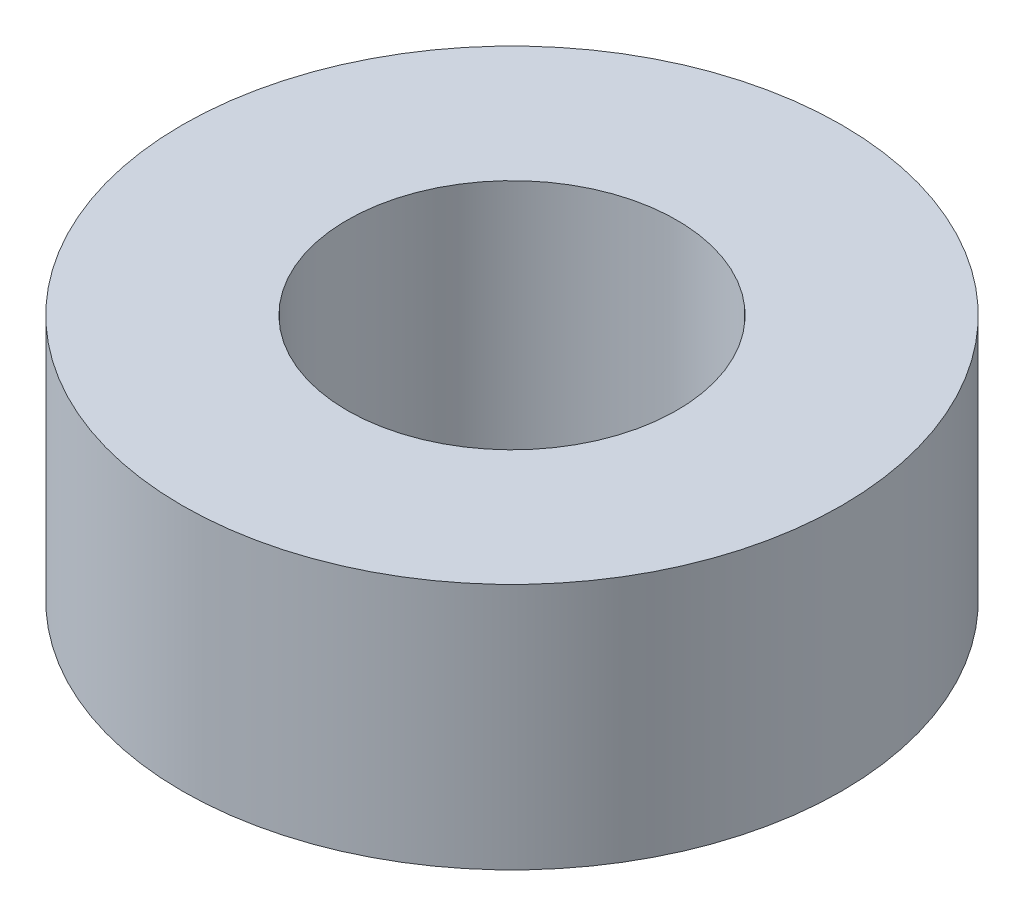
ISO-10303-21;
HEADER;
FILE_DESCRIPTION(('STEP AP214'),'2;1');
FILE_NAME('part.step','',(''),(''),'','','');
FILE_SCHEMA(('AUTOMOTIVE_DESIGN { 1 0 10303 214 1 1 1 1 }'));
ENDSEC;
DATA;
#1=APPLICATION_CONTEXT('core data for automotive mechanical design processes');
#2=APPLICATION_PROTOCOL_DEFINITION('international standard','automotive_design',2000,#1);
#3=PRODUCT_CONTEXT('',#1,'mechanical');
#4=PRODUCT('Part','Part','',(#3));
#5=PRODUCT_RELATED_PRODUCT_CATEGORY('part','',(#4));
#6=PRODUCT_DEFINITION_FORMATION('','',#4);
#7=PRODUCT_DEFINITION_CONTEXT('part definition',#1,'design');
#8=PRODUCT_DEFINITION('design','',#6,#7);
#9=PRODUCT_DEFINITION_SHAPE('','',#8);
#10=(LENGTH_UNIT() NAMED_UNIT(*) SI_UNIT(.MILLI.,.METRE.));
#11=(NAMED_UNIT(*) PLANE_ANGLE_UNIT() SI_UNIT($,.RADIAN.));
#12=(NAMED_UNIT(*) SI_UNIT($,.STERADIAN.) SOLID_ANGLE_UNIT());
#13=UNCERTAINTY_MEASURE_WITH_UNIT(LENGTH_MEASURE(1.E-05),#10,'distance_accuracy_value','');
#14=(GEOMETRIC_REPRESENTATION_CONTEXT(3) GLOBAL_UNCERTAINTY_ASSIGNED_CONTEXT((#13)) GLOBAL_UNIT_ASSIGNED_CONTEXT((#10,
#11,#12)) REPRESENTATION_CONTEXT('',''));
#15=CARTESIAN_POINT('',(0.,0.,0.));
#16=DIRECTION('',(0.,0.,1.));
#17=DIRECTION('',(1.,0.,0.));
#18=AXIS2_PLACEMENT_3D('',#15,#16,#17);
#19=CARTESIAN_POINT('',(0.,3.,0.));
#20=DIRECTION('',(0.,1.,0.));
#21=DIRECTION('',(0.,0.,1.));
#22=AXIS2_PLACEMENT_3D('',#19,#20,#21);
#23=PLANE('',#22);
#24=CARTESIAN_POINT('',(0.,3.,0.));
#25=DIRECTION('',(0.,1.,0.));
#26=DIRECTION('',(0.,0.,1.));
#27=AXIS2_PLACEMENT_3D('',#24,#25,#26);
#28=CIRCLE('',#27,4.);
#29=CARTESIAN_POINT('',(0.,3.,4.));
#30=VERTEX_POINT('',#29);
#31=EDGE_CURVE('E10',#30,#30,#28,.T.);
#32=ORIENTED_EDGE('',*,*,#31,.T.);
#33=EDGE_LOOP('',(#32));
#34=FACE_BOUND('',#33,.T.);
#35=CARTESIAN_POINT('',(0.,3.,0.));
#36=DIRECTION('',(0.,1.,0.));
#37=DIRECTION('',(0.,0.,1.));
#38=AXIS2_PLACEMENT_3D('',#35,#36,#37);
#39=CIRCLE('',#38,2.);
#40=CARTESIAN_POINT('',(0.,3.,2.));
#41=VERTEX_POINT('',#40);
#42=EDGE_CURVE('E56',#41,#41,#39,.T.);
#43=ORIENTED_EDGE('',*,*,#42,.F.);
#44=EDGE_LOOP('',(#43));
#45=FACE_BOUND('',#44,.T.);
#46=ADVANCED_FACE('F43',(#34,#45),#23,.T.);
#47=CARTESIAN_POINT('',(0.,0.,0.));
#48=DIRECTION('',(0.,1.,0.));
#49=DIRECTION('',(0.,0.,1.));
#50=AXIS2_PLACEMENT_3D('',#47,#48,#49);
#51=PLANE('',#50);
#52=CARTESIAN_POINT('',(0.,0.,0.));
#53=DIRECTION('',(0.,1.,0.));
#54=DIRECTION('',(0.,0.,1.));
#55=AXIS2_PLACEMENT_3D('',#52,#53,#54);
#56=CIRCLE('',#55,4.);
#57=CARTESIAN_POINT('',(0.,0.,4.));
#58=VERTEX_POINT('',#57);
#59=EDGE_CURVE('E47',#58,#58,#56,.T.);
#60=ORIENTED_EDGE('',*,*,#59,.F.);
#61=EDGE_LOOP('',(#60));
#62=FACE_BOUND('',#61,.T.);
#63=CARTESIAN_POINT('',(0.,0.,0.));
#64=DIRECTION('',(0.,1.,0.));
#65=DIRECTION('',(0.,0.,1.));
#66=AXIS2_PLACEMENT_3D('',#63,#64,#65);
#67=CIRCLE('',#66,2.);
#68=CARTESIAN_POINT('',(0.,0.,2.));
#69=VERTEX_POINT('',#68);
#70=EDGE_CURVE('E58',#69,#69,#67,.T.);
#71=ORIENTED_EDGE('',*,*,#70,.T.);
#72=EDGE_LOOP('',(#71));
#73=FACE_BOUND('',#72,.T.);
#74=ADVANCED_FACE('F70',(#62,#73),#51,.F.);
#75=CARTESIAN_POINT('',(0.,3.,0.));
#76=DIRECTION('',(0.,-1.,0.));
#77=DIRECTION('',(0.,0.,-1.));
#78=AXIS2_PLACEMENT_3D('',#75,#76,#77);
#79=CYLINDRICAL_SURFACE('',#78,4.);
#80=ORIENTED_EDGE('',*,*,#31,.F.);
#81=EDGE_LOOP('',(#80));
#82=FACE_BOUND('',#81,.T.);
#83=ORIENTED_EDGE('',*,*,#59,.T.);
#84=EDGE_LOOP('',(#83));
#85=FACE_BOUND('',#84,.T.);
#86=ADVANCED_FACE('F45',(#82,#85),#79,.T.);
#87=CARTESIAN_POINT('',(0.,3.,0.));
#88=DIRECTION('',(0.,-1.,0.));
#89=DIRECTION('',(0.,0.,-1.));
#90=AXIS2_PLACEMENT_3D('',#87,#88,#89);
#91=CYLINDRICAL_SURFACE('',#90,2.);
#92=ORIENTED_EDGE('',*,*,#42,.T.);
#93=EDGE_LOOP('',(#92));
#94=FACE_BOUND('',#93,.T.);
#95=ORIENTED_EDGE('',*,*,#70,.F.);
#96=EDGE_LOOP('',(#95));
#97=FACE_BOUND('',#96,.T.);
#98=ADVANCED_FACE('F66',(#94,#97),#91,.F.);
#99=CLOSED_SHELL('',(#46,#74,#86,#98));
#100=MANIFOLD_SOLID_BREP('B2',#99);
#101=ADVANCED_BREP_SHAPE_REPRESENTATION('',(#18,#100),#14);
#102=SHAPE_DEFINITION_REPRESENTATION(#9,#101);
ENDSEC;
END-ISO-10303-21;
